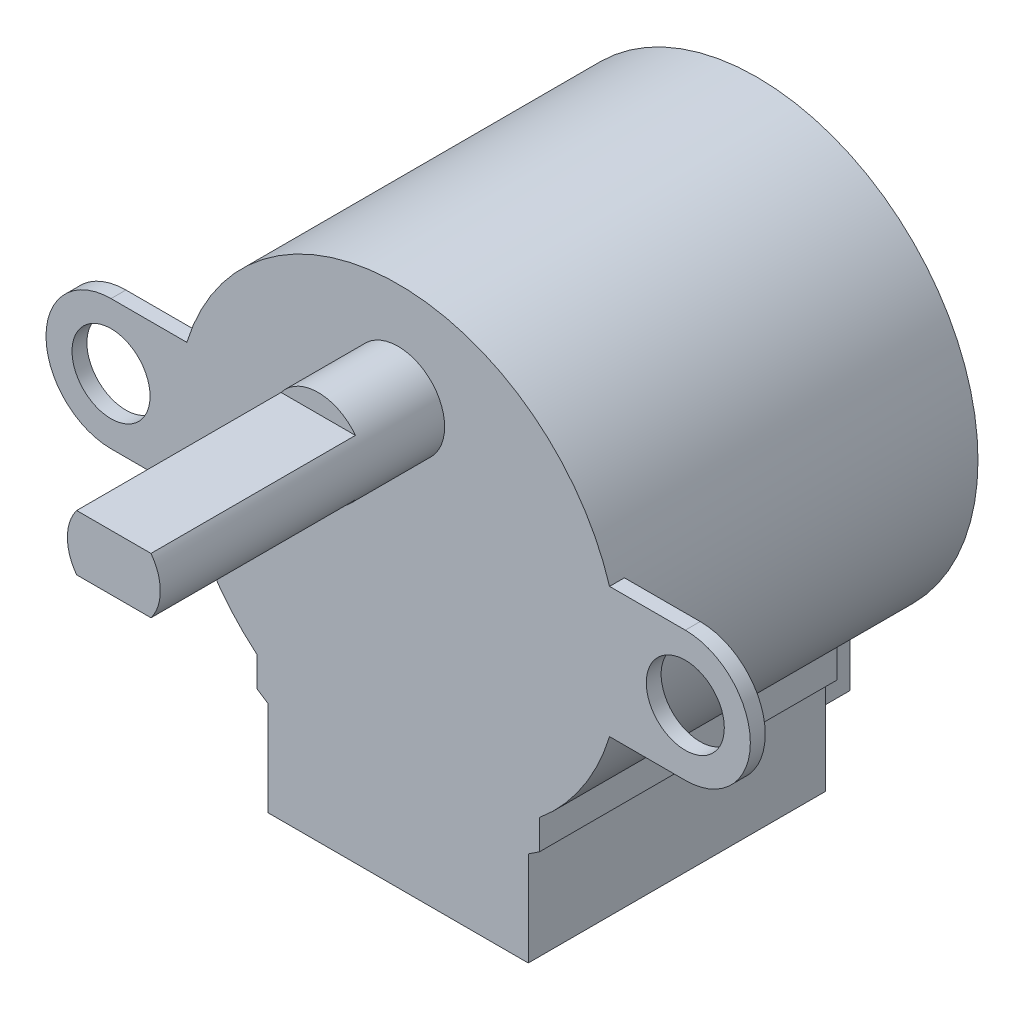
ISO-10303-21;
HEADER;
FILE_DESCRIPTION(('STEP AP214'),'2;1');
FILE_NAME('part.step','',(''),(''),'','','');
FILE_SCHEMA(('AUTOMOTIVE_DESIGN { 1 0 10303 214 1 1 1 1 }'));
ENDSEC;
DATA;
#1=APPLICATION_CONTEXT('core data for automotive mechanical design processes');
#2=APPLICATION_PROTOCOL_DEFINITION('international standard','automotive_design',2000,#1);
#3=PRODUCT_CONTEXT('',#1,'mechanical');
#4=PRODUCT('Part','Part','',(#3));
#5=PRODUCT_RELATED_PRODUCT_CATEGORY('part','',(#4));
#6=PRODUCT_DEFINITION_FORMATION('','',#4);
#7=PRODUCT_DEFINITION_CONTEXT('part definition',#1,'design');
#8=PRODUCT_DEFINITION('design','',#6,#7);
#9=PRODUCT_DEFINITION_SHAPE('','',#8);
#10=(LENGTH_UNIT() NAMED_UNIT(*) SI_UNIT(.MILLI.,.METRE.));
#11=(NAMED_UNIT(*) PLANE_ANGLE_UNIT() SI_UNIT($,.RADIAN.));
#12=(NAMED_UNIT(*) SI_UNIT($,.STERADIAN.) SOLID_ANGLE_UNIT());
#13=UNCERTAINTY_MEASURE_WITH_UNIT(LENGTH_MEASURE(1.E-05),#10,'distance_accuracy_value','');
#14=(GEOMETRIC_REPRESENTATION_CONTEXT(3) GLOBAL_UNCERTAINTY_ASSIGNED_CONTEXT((#13)) GLOBAL_UNIT_ASSIGNED_CONTEXT((#10,
#11,#12)) REPRESENTATION_CONTEXT('',''));
#15=CARTESIAN_POINT('',(0.,0.,0.));
#16=DIRECTION('',(0.,0.,1.));
#17=DIRECTION('',(1.,0.,0.));
#18=AXIS2_PLACEMENT_3D('',#15,#16,#17);
#19=CARTESIAN_POINT('',(0.,0.,0.));
#20=DIRECTION('',(0.,0.,1.));
#21=DIRECTION('',(1.,0.,0.));
#22=AXIS2_PLACEMENT_3D('',#19,#20,#21);
#23=PLANE('',#22);
#24=CARTESIAN_POINT('',(15.45,0.,0.));
#25=DIRECTION('',(0.,0.,1.));
#26=DIRECTION('',(1.,0.,0.));
#27=AXIS2_PLACEMENT_3D('',#24,#25,#26);
#28=CIRCLE('',#27,2.1);
#29=CARTESIAN_POINT('',(17.55,0.,0.));
#30=VERTEX_POINT('',#29);
#31=EDGE_CURVE('E285',#30,#30,#28,.T.);
#32=ORIENTED_EDGE('',*,*,#31,.F.);
#33=EDGE_LOOP('',(#32));
#34=FACE_BOUND('',#33,.T.);
#35=CARTESIAN_POINT('',(-15.45,0.,0.));
#36=DIRECTION('',(0.,0.,1.));
#37=DIRECTION('',(1.,0.,0.));
#38=AXIS2_PLACEMENT_3D('',#35,#36,#37);
#39=CIRCLE('',#38,2.1);
#40=CARTESIAN_POINT('',(-13.35,0.,0.));
#41=VERTEX_POINT('',#40);
#42=EDGE_CURVE('E317',#41,#41,#39,.T.);
#43=ORIENTED_EDGE('',*,*,#42,.F.);
#44=EDGE_LOOP('',(#43));
#45=FACE_BOUND('',#44,.T.);
#46=CARTESIAN_POINT('',(0.,0.,0.));
#47=DIRECTION('',(0.,0.,1.));
#48=DIRECTION('',(1.,0.,0.));
#49=AXIS2_PLACEMENT_3D('',#46,#47,#48);
#50=CIRCLE('',#49,11.9);
#51=CARTESIAN_POINT('',(7.6,-9.15696456256111,0.));
#52=VERTEX_POINT('',#51);
#53=CARTESIAN_POINT('',(11.3736537664903,-3.50000000000001,0.));
#54=VERTEX_POINT('',#53);
#55=EDGE_CURVE('E439',#52,#54,#50,.T.);
#56=ORIENTED_EDGE('',*,*,#55,.T.);
#57=DIRECTION('',(1.,0.,0.));
#58=VECTOR('',#57,1.);
#59=CARTESIAN_POINT('',(15.45,-3.5,0.));
#60=LINE('',#59,#58);
#61=CARTESIAN_POINT('',(15.45,-3.5,0.));
#62=VERTEX_POINT('',#61);
#63=EDGE_CURVE('E299',#54,#62,#60,.T.);
#64=ORIENTED_EDGE('',*,*,#63,.T.);
#65=CARTESIAN_POINT('',(15.45,0.,0.));
#66=DIRECTION('',(0.,0.,1.));
#67=DIRECTION('',(1.,0.,0.));
#68=AXIS2_PLACEMENT_3D('',#65,#66,#67);
#69=CIRCLE('',#68,3.5);
#70=CARTESIAN_POINT('',(15.45,3.5,0.));
#71=VERTEX_POINT('',#70);
#72=EDGE_CURVE('E292',#62,#71,#69,.T.);
#73=ORIENTED_EDGE('',*,*,#72,.T.);
#74=DIRECTION('',(-1.,0.,0.));
#75=VECTOR('',#74,1.);
#76=CARTESIAN_POINT('',(15.45,3.5,0.));
#77=LINE('',#76,#75);
#78=CARTESIAN_POINT('',(11.3736537664903,3.5,0.));
#79=VERTEX_POINT('',#78);
#80=EDGE_CURVE('E311',#71,#79,#77,.T.);
#81=ORIENTED_EDGE('',*,*,#80,.T.);
#82=CARTESIAN_POINT('',(-11.3736537664903,3.5,0.));
#83=VERTEX_POINT('',#82);
#84=EDGE_CURVE('E448',#79,#83,#50,.T.);
#85=ORIENTED_EDGE('',*,*,#84,.T.);
#86=DIRECTION('',(-1.,0.,0.));
#87=VECTOR('',#86,1.);
#88=CARTESIAN_POINT('',(-15.45,3.5,0.));
#89=LINE('',#88,#87);
#90=CARTESIAN_POINT('',(-15.45,3.5,0.));
#91=VERTEX_POINT('',#90);
#92=EDGE_CURVE('E335',#83,#91,#89,.T.);
#93=ORIENTED_EDGE('',*,*,#92,.T.);
#94=CARTESIAN_POINT('',(-15.45,0.,0.));
#95=DIRECTION('',(0.,0.,1.));
#96=DIRECTION('',(1.,0.,0.));
#97=AXIS2_PLACEMENT_3D('',#94,#95,#96);
#98=CIRCLE('',#97,3.5);
#99=CARTESIAN_POINT('',(-15.45,-3.5,0.));
#100=VERTEX_POINT('',#99);
#101=EDGE_CURVE('E328',#91,#100,#98,.T.);
#102=ORIENTED_EDGE('',*,*,#101,.T.);
#103=DIRECTION('',(1.,0.,0.));
#104=VECTOR('',#103,1.);
#105=CARTESIAN_POINT('',(-15.45,-3.5,0.));
#106=LINE('',#105,#104);
#107=CARTESIAN_POINT('',(-11.3736537664903,-3.5,0.));
#108=VERTEX_POINT('',#107);
#109=EDGE_CURVE('E347',#100,#108,#106,.T.);
#110=ORIENTED_EDGE('',*,*,#109,.T.);
#111=CARTESIAN_POINT('',(-7.6,-9.15696456256111,0.));
#112=VERTEX_POINT('',#111);
#113=EDGE_CURVE('E418',#108,#112,#50,.T.);
#114=ORIENTED_EDGE('',*,*,#113,.T.);
#115=DIRECTION('',(0.,-1.,0.));
#116=VECTOR('',#115,1.);
#117=CARTESIAN_POINT('',(-7.6,-10.7569645625611,0.));
#118=LINE('',#117,#116);
#119=CARTESIAN_POINT('',(-7.6,-10.7569645625611,0.));
#120=VERTEX_POINT('',#119);
#121=EDGE_CURVE('E406',#112,#120,#118,.T.);
#122=ORIENTED_EDGE('',*,*,#121,.T.);
#123=DIRECTION('',(0.835522663765061,-0.549455983983191,0.));
#124=VECTOR('',#123,1.);
#125=CARTESIAN_POINT('',(-7.,-11.151536253656,0.));
#126=LINE('',#125,#124);
#127=CARTESIAN_POINT('',(-7.,-11.151536253656,0.));
#128=VERTEX_POINT('',#127);
#129=EDGE_CURVE('E409',#120,#128,#126,.T.);
#130=ORIENTED_EDGE('',*,*,#129,.T.);
#131=DIRECTION('',(0.,-1.,0.));
#132=VECTOR('',#131,1.);
#133=CARTESIAN_POINT('',(-6.99999999999999,-16.2377112189195,0.));
#134=LINE('',#133,#132);
#135=CARTESIAN_POINT('',(-6.99999999999999,-16.2377112189195,0.));
#136=VERTEX_POINT('',#135);
#137=EDGE_CURVE('E412',#128,#136,#134,.T.);
#138=ORIENTED_EDGE('',*,*,#137,.T.);
#139=DIRECTION('',(1.,0.,0.));
#140=VECTOR('',#139,1.);
#141=CARTESIAN_POINT('',(0.,-16.2377112189195,0.));
#142=LINE('',#141,#140);
#143=CARTESIAN_POINT('',(7.,-16.2377112189195,0.));
#144=VERTEX_POINT('',#143);
#145=EDGE_CURVE('E365',#136,#144,#142,.T.);
#146=ORIENTED_EDGE('',*,*,#145,.T.);
#147=DIRECTION('',(0.,1.,0.));
#148=VECTOR('',#147,1.);
#149=CARTESIAN_POINT('',(7.,-16.2377112189195,0.));
#150=LINE('',#149,#148);
#151=CARTESIAN_POINT('',(7.,-11.151536253656,0.));
#152=VERTEX_POINT('',#151);
#153=EDGE_CURVE('E353',#144,#152,#150,.T.);
#154=ORIENTED_EDGE('',*,*,#153,.T.);
#155=DIRECTION('',(0.835522663765057,0.549455983983197,0.));
#156=VECTOR('',#155,1.);
#157=CARTESIAN_POINT('',(7.,-11.151536253656,0.));
#158=LINE('',#157,#156);
#159=CARTESIAN_POINT('',(7.6,-10.7569645625611,0.));
#160=VERTEX_POINT('',#159);
#161=EDGE_CURVE('E401',#152,#160,#158,.T.);
#162=ORIENTED_EDGE('',*,*,#161,.T.);
#163=DIRECTION('',(0.,1.,0.));
#164=VECTOR('',#163,1.);
#165=CARTESIAN_POINT('',(7.6,-10.7569645625611,0.));
#166=LINE('',#165,#164);
#167=EDGE_CURVE('E404',#160,#52,#166,.T.);
#168=ORIENTED_EDGE('',*,*,#167,.T.);
#169=EDGE_LOOP('',(#56,#64,#73,#81,#85,#93,#102,#110,#114,#122,#130,#138,#146,#154,#162,#168));
#170=FACE_BOUND('',#169,.T.);
#171=CARTESIAN_POINT('',(0.,6.5,0.));
#172=DIRECTION('',(0.,0.,1.));
#173=DIRECTION('',(1.,0.,0.));
#174=AXIS2_PLACEMENT_3D('',#171,#172,#173);
#175=CIRCLE('',#174,2.5);
#176=CARTESIAN_POINT('',(2.5,6.5,0.));
#177=VERTEX_POINT('',#176);
#178=EDGE_CURVE('E280',#177,#177,#175,.T.);
#179=ORIENTED_EDGE('',*,*,#178,.F.);
#180=EDGE_LOOP('',(#179));
#181=FACE_BOUND('',#180,.T.);
#182=ADVANCED_FACE('F32',(#34,#45,#170,#181),#23,.T.);
#183=CARTESIAN_POINT('',(-5.,-14.1986110217935,-19.3));
#184=DIRECTION('',(-1.,0.,0.));
#185=DIRECTION('',(0.,0.,1.));
#186=AXIS2_PLACEMENT_3D('',#183,#184,#185);
#187=PLANE('',#186);
#188=DIRECTION('',(0.,0.,1.));
#189=VECTOR('',#188,1.);
#190=CARTESIAN_POINT('',(-5.,-14.1986110217935,-19.3));
#191=LINE('',#190,#189);
#192=CARTESIAN_POINT('',(-5.,-14.1986110217935,-19.3));
#193=VERTEX_POINT('',#192);
#194=CARTESIAN_POINT('',(-5.,-14.1986110217935,-16.));
#195=VERTEX_POINT('',#194);
#196=EDGE_CURVE('E36',#193,#195,#191,.T.);
#197=ORIENTED_EDGE('',*,*,#196,.T.);
#198=DIRECTION('',(0.,1.,0.));
#199=VECTOR('',#198,1.);
#200=CARTESIAN_POINT('',(-5.,-10.7986110217935,-16.));
#201=LINE('',#200,#199);
#202=CARTESIAN_POINT('',(-5.,-10.7986110217935,-16.));
#203=VERTEX_POINT('',#202);
#204=EDGE_CURVE('E383',#195,#203,#201,.T.);
#205=ORIENTED_EDGE('',*,*,#204,.T.);
#206=DIRECTION('',(0.,0.,1.));
#207=VECTOR('',#206,1.);
#208=CARTESIAN_POINT('',(-5.,-10.7986110217935,-19.3));
#209=LINE('',#208,#207);
#210=CARTESIAN_POINT('',(-5.,-10.7986110217935,-19.3));
#211=VERTEX_POINT('',#210);
#212=EDGE_CURVE('E11',#211,#203,#209,.T.);
#213=ORIENTED_EDGE('',*,*,#212,.F.);
#214=DIRECTION('',(0.,-1.,0.));
#215=VECTOR('',#214,1.);
#216=CARTESIAN_POINT('',(-5.,-14.1986110217935,-19.3));
#217=LINE('',#216,#215);
#218=EDGE_CURVE('E435',#211,#193,#217,.T.);
#219=ORIENTED_EDGE('',*,*,#218,.T.);
#220=EDGE_LOOP('',(#197,#205,#213,#219));
#221=FACE_BOUND('',#220,.T.);
#222=ADVANCED_FACE('F34',(#221),#187,.T.);
#223=CARTESIAN_POINT('',(5.,-14.1986110217935,-19.3));
#224=DIRECTION('',(1.,0.,0.));
#225=DIRECTION('',(0.,0.,-1.));
#226=AXIS2_PLACEMENT_3D('',#223,#224,#225);
#227=PLANE('',#226);
#228=DIRECTION('',(0.,0.,1.));
#229=VECTOR('',#228,1.);
#230=CARTESIAN_POINT('',(5.,-10.7986110217935,-19.3));
#231=LINE('',#230,#229);
#232=CARTESIAN_POINT('',(5.,-10.7986110217935,-19.3));
#233=VERTEX_POINT('',#232);
#234=CARTESIAN_POINT('',(5.,-10.7986110217935,-16.));
#235=VERTEX_POINT('',#234);
#236=EDGE_CURVE('E41',#233,#235,#231,.T.);
#237=ORIENTED_EDGE('',*,*,#236,.T.);
#238=DIRECTION('',(0.,-1.,0.));
#239=VECTOR('',#238,1.);
#240=CARTESIAN_POINT('',(5.,-14.1986110217935,-16.));
#241=LINE('',#240,#239);
#242=CARTESIAN_POINT('',(5.,-14.1986110217935,-16.));
#243=VERTEX_POINT('',#242);
#244=EDGE_CURVE('E377',#235,#243,#241,.T.);
#245=ORIENTED_EDGE('',*,*,#244,.T.);
#246=DIRECTION('',(0.,0.,1.));
#247=VECTOR('',#246,1.);
#248=CARTESIAN_POINT('',(5.,-14.1986110217935,-19.3));
#249=LINE('',#248,#247);
#250=CARTESIAN_POINT('',(5.,-14.1986110217935,-19.3));
#251=VERTEX_POINT('',#250);
#252=EDGE_CURVE('E451',#251,#243,#249,.T.);
#253=ORIENTED_EDGE('',*,*,#252,.F.);
#254=DIRECTION('',(0.,1.,0.));
#255=VECTOR('',#254,1.);
#256=CARTESIAN_POINT('',(5.,-14.1986110217935,-19.3));
#257=LINE('',#256,#255);
#258=EDGE_CURVE('E441',#251,#233,#257,.T.);
#259=ORIENTED_EDGE('',*,*,#258,.T.);
#260=EDGE_LOOP('',(#237,#245,#253,#259));
#261=FACE_BOUND('',#260,.T.);
#262=ADVANCED_FACE('F465',(#261),#227,.T.);
#263=CARTESIAN_POINT('',(5.,-14.1986110217935,-19.3));
#264=DIRECTION('',(0.,-1.,0.));
#265=DIRECTION('',(0.,0.,-1.));
#266=AXIS2_PLACEMENT_3D('',#263,#264,#265);
#267=PLANE('',#266);
#268=ORIENTED_EDGE('',*,*,#252,.T.);
#269=DIRECTION('',(-1.,0.,0.));
#270=VECTOR('',#269,1.);
#271=CARTESIAN_POINT('',(-5.,-14.1986110217935,-16.));
#272=LINE('',#271,#270);
#273=EDGE_CURVE('E380',#243,#195,#272,.T.);
#274=ORIENTED_EDGE('',*,*,#273,.T.);
#275=ORIENTED_EDGE('',*,*,#196,.F.);
#276=DIRECTION('',(1.,0.,0.));
#277=VECTOR('',#276,1.);
#278=CARTESIAN_POINT('',(-5.,-14.1986110217935,-19.3));
#279=LINE('',#278,#277);
#280=EDGE_CURVE('E438',#193,#251,#279,.T.);
#281=ORIENTED_EDGE('',*,*,#280,.T.);
#282=EDGE_LOOP('',(#268,#274,#275,#281));
#283=FACE_BOUND('',#282,.T.);
#284=ADVANCED_FACE('F459',(#283),#267,.T.);
#285=CARTESIAN_POINT('',(0.,0.,-19.3));
#286=DIRECTION('',(0.,0.,1.));
#287=DIRECTION('',(1.,0.,0.));
#288=AXIS2_PLACEMENT_3D('',#285,#286,#287);
#289=CYLINDRICAL_SURFACE('',#288,11.9);
#290=DIRECTION('',(0.,0.,1.));
#291=VECTOR('',#290,1.);
#292=CARTESIAN_POINT('',(11.3736537664903,-3.50000000000001,-0.8));
#293=LINE('',#292,#291);
#294=CARTESIAN_POINT('',(11.3736537664903,-3.50000000000001,-0.8));
#295=VERTEX_POINT('',#294);
#296=EDGE_CURVE('E318',#295,#54,#293,.T.);
#297=ORIENTED_EDGE('',*,*,#296,.T.);
#298=ORIENTED_EDGE('',*,*,#55,.F.);
#299=DIRECTION('',(0.,0.,1.));
#300=VECTOR('',#299,1.);
#301=CARTESIAN_POINT('',(7.6,-9.15696456256112,-16.));
#302=LINE('',#301,#300);
#303=CARTESIAN_POINT('',(7.6,-9.15696456256112,-16.));
#304=VERTEX_POINT('',#303);
#305=EDGE_CURVE('E426',#304,#52,#302,.T.);
#306=ORIENTED_EDGE('',*,*,#305,.F.);
#307=CARTESIAN_POINT('',(0.,0.,-16.));
#308=DIRECTION('',(0.,0.,-1.));
#309=DIRECTION('',(1.,0.,0.));
#310=AXIS2_PLACEMENT_3D('',#307,#308,#309);
#311=CIRCLE('',#310,11.9);
#312=EDGE_CURVE('E374',#304,#235,#311,.T.);
#313=ORIENTED_EDGE('',*,*,#312,.T.);
#314=ORIENTED_EDGE('',*,*,#236,.F.);
#315=CARTESIAN_POINT('',(0.,0.,-19.3));
#316=DIRECTION('',(0.,0.,1.));
#317=DIRECTION('',(1.,0.,0.));
#318=AXIS2_PLACEMENT_3D('',#315,#316,#317);
#319=CIRCLE('',#318,11.9);
#320=EDGE_CURVE('E444',#233,#211,#319,.T.);
#321=ORIENTED_EDGE('',*,*,#320,.T.);
#322=ORIENTED_EDGE('',*,*,#212,.T.);
#323=CARTESIAN_POINT('',(0.,0.,-16.));
#324=DIRECTION('',(0.,0.,-1.));
#325=DIRECTION('',(1.,0.,0.));
#326=AXIS2_PLACEMENT_3D('',#323,#324,#325);
#327=CIRCLE('',#326,11.9);
#328=CARTESIAN_POINT('',(-7.6,-9.15696456256111,-16.));
#329=VERTEX_POINT('',#328);
#330=EDGE_CURVE('E386',#203,#329,#327,.T.);
#331=ORIENTED_EDGE('',*,*,#330,.T.);
#332=DIRECTION('',(0.,0.,1.));
#333=VECTOR('',#332,1.);
#334=CARTESIAN_POINT('',(-7.6,-9.15696456256111,-16.));
#335=LINE('',#334,#333);
#336=EDGE_CURVE('E423',#329,#112,#335,.T.);
#337=ORIENTED_EDGE('',*,*,#336,.T.);
#338=ORIENTED_EDGE('',*,*,#113,.F.);
#339=DIRECTION('',(0.,0.,1.));
#340=VECTOR('',#339,1.);
#341=CARTESIAN_POINT('',(-11.3736537664903,-3.5,-0.8));
#342=LINE('',#341,#340);
#343=CARTESIAN_POINT('',(-11.3736537664903,-3.5,-0.8));
#344=VERTEX_POINT('',#343);
#345=EDGE_CURVE('E357',#344,#108,#342,.T.);
#346=ORIENTED_EDGE('',*,*,#345,.F.);
#347=CARTESIAN_POINT('',(0.,0.,-0.8));
#348=DIRECTION('',(0.,0.,-1.));
#349=DIRECTION('',(1.,0.,0.));
#350=AXIS2_PLACEMENT_3D('',#347,#348,#349);
#351=CIRCLE('',#350,11.9);
#352=CARTESIAN_POINT('',(-11.3736537664903,3.5,-0.8));
#353=VERTEX_POINT('',#352);
#354=EDGE_CURVE('E338',#344,#353,#351,.T.);
#355=ORIENTED_EDGE('',*,*,#354,.T.);
#356=DIRECTION('',(0.,0.,1.));
#357=VECTOR('',#356,1.);
#358=CARTESIAN_POINT('',(-11.3736537664903,3.5,-0.8));
#359=LINE('',#358,#357);
#360=EDGE_CURVE('E354',#353,#83,#359,.T.);
#361=ORIENTED_EDGE('',*,*,#360,.T.);
#362=ORIENTED_EDGE('',*,*,#84,.F.);
#363=DIRECTION('',(0.,0.,1.));
#364=VECTOR('',#363,1.);
#365=CARTESIAN_POINT('',(11.3736537664903,3.5,-0.8));
#366=LINE('',#365,#364);
#367=CARTESIAN_POINT('',(11.3736537664903,3.5,-0.8));
#368=VERTEX_POINT('',#367);
#369=EDGE_CURVE('E321',#368,#79,#366,.T.);
#370=ORIENTED_EDGE('',*,*,#369,.F.);
#371=CARTESIAN_POINT('',(0.,0.,-0.8));
#372=DIRECTION('',(0.,0.,-1.));
#373=DIRECTION('',(1.,0.,0.));
#374=AXIS2_PLACEMENT_3D('',#371,#372,#373);
#375=CIRCLE('',#374,11.9);
#376=EDGE_CURVE('E302',#368,#295,#375,.T.);
#377=ORIENTED_EDGE('',*,*,#376,.T.);
#378=EDGE_LOOP('',(#297,#298,#306,#313,#314,#321,#322,#331,#337,#338,#346,#355,#361,#362,#370,#377));
#379=FACE_BOUND('',#378,.T.);
#380=ADVANCED_FACE('F471',(#379),#289,.T.);
#381=CARTESIAN_POINT('',(0.,0.,-19.3));
#382=DIRECTION('',(0.,0.,1.));
#383=DIRECTION('',(1.,0.,0.));
#384=AXIS2_PLACEMENT_3D('',#381,#382,#383);
#385=PLANE('',#384);
#386=ORIENTED_EDGE('',*,*,#218,.F.);
#387=ORIENTED_EDGE('',*,*,#320,.F.);
#388=ORIENTED_EDGE('',*,*,#258,.F.);
#389=ORIENTED_EDGE('',*,*,#280,.F.);
#390=EDGE_LOOP('',(#386,#387,#388,#389));
#391=FACE_BOUND('',#390,.T.);
#392=ADVANCED_FACE('F462',(#391),#385,.F.);
#393=CARTESIAN_POINT('',(0.,-16.2377112189195,-16.));
#394=DIRECTION('',(0.,-1.,0.));
#395=DIRECTION('',(0.,0.,-1.));
#396=AXIS2_PLACEMENT_3D('',#393,#394,#395);
#397=PLANE('',#396);
#398=DIRECTION('',(-1.,0.,0.));
#399=VECTOR('',#398,1.);
#400=CARTESIAN_POINT('',(0.,-16.2377112189195,-2.));
#401=LINE('',#400,#399);
#402=CARTESIAN_POINT('',(3.25,-16.2377112189195,-2.));
#403=VERTEX_POINT('',#402);
#404=CARTESIAN_POINT('',(-3.25,-16.2377112189195,-2.));
#405=VERTEX_POINT('',#404);
#406=EDGE_CURVE('E224',#403,#405,#401,.T.);
#407=ORIENTED_EDGE('',*,*,#406,.F.);
#408=DIRECTION('',(0.,0.,1.));
#409=VECTOR('',#408,1.);
#410=CARTESIAN_POINT('',(3.25,-16.2377112189195,-2.));
#411=LINE('',#410,#409);
#412=CARTESIAN_POINT('',(3.25,-16.2377112189195,-3.2));
#413=VERTEX_POINT('',#412);
#414=EDGE_CURVE('E240',#413,#403,#411,.T.);
#415=ORIENTED_EDGE('',*,*,#414,.F.);
#416=DIRECTION('',(1.,0.,0.));
#417=VECTOR('',#416,1.);
#418=CARTESIAN_POINT('',(0.,-16.2377112189195,-3.2));
#419=LINE('',#418,#417);
#420=CARTESIAN_POINT('',(-3.25,-16.2377112189195,-3.2));
#421=VERTEX_POINT('',#420);
#422=EDGE_CURVE('E247',#421,#413,#419,.T.);
#423=ORIENTED_EDGE('',*,*,#422,.F.);
#424=DIRECTION('',(0.,0.,-1.));
#425=VECTOR('',#424,1.);
#426=CARTESIAN_POINT('',(-3.25,-16.2377112189195,-2.));
#427=LINE('',#426,#425);
#428=EDGE_CURVE('E245',#405,#421,#427,.T.);
#429=ORIENTED_EDGE('',*,*,#428,.F.);
#430=EDGE_LOOP('',(#407,#415,#423,#429));
#431=FACE_BOUND('',#430,.T.);
#432=ORIENTED_EDGE('',*,*,#145,.F.);
#433=DIRECTION('',(0.,0.,1.));
#434=VECTOR('',#433,1.);
#435=CARTESIAN_POINT('',(-6.99999999999999,-16.2377112189195,-16.));
#436=LINE('',#435,#434);
#437=CARTESIAN_POINT('',(-6.99999999999999,-16.2377112189195,-16.));
#438=VERTEX_POINT('',#437);
#439=EDGE_CURVE('E416',#438,#136,#436,.T.);
#440=ORIENTED_EDGE('',*,*,#439,.F.);
#441=DIRECTION('',(1.,0.,0.));
#442=VECTOR('',#441,1.);
#443=CARTESIAN_POINT('',(0.,-16.2377112189195,-16.));
#444=LINE('',#443,#442);
#445=CARTESIAN_POINT('',(7.,-16.2377112189195,-16.));
#446=VERTEX_POINT('',#445);
#447=EDGE_CURVE('E361',#438,#446,#444,.T.);
#448=ORIENTED_EDGE('',*,*,#447,.T.);
#449=DIRECTION('',(0.,0.,1.));
#450=VECTOR('',#449,1.);
#451=CARTESIAN_POINT('',(7.,-16.2377112189195,-16.));
#452=LINE('',#451,#450);
#453=EDGE_CURVE('E398',#446,#144,#452,.T.);
#454=ORIENTED_EDGE('',*,*,#453,.T.);
#455=EDGE_LOOP('',(#432,#440,#448,#454));
#456=FACE_BOUND('',#455,.T.);
#457=ADVANCED_FACE('F488',(#431,#456),#397,.T.);
#458=CARTESIAN_POINT('',(-6.99999999999999,-16.2377112189195,-16.));
#459=DIRECTION('',(-1.,0.,0.));
#460=DIRECTION('',(0.,-1.,0.));
#461=AXIS2_PLACEMENT_3D('',#458,#459,#460);
#462=PLANE('',#461);
#463=ORIENTED_EDGE('',*,*,#137,.F.);
#464=DIRECTION('',(0.,0.,1.));
#465=VECTOR('',#464,1.);
#466=CARTESIAN_POINT('',(-7.,-11.151536253656,-16.));
#467=LINE('',#466,#465);
#468=CARTESIAN_POINT('',(-7.,-11.151536253656,-16.));
#469=VERTEX_POINT('',#468);
#470=EDGE_CURVE('E419',#469,#128,#467,.T.);
#471=ORIENTED_EDGE('',*,*,#470,.F.);
#472=DIRECTION('',(0.,-1.,0.));
#473=VECTOR('',#472,1.);
#474=CARTESIAN_POINT('',(-6.99999999999999,-16.2377112189195,-16.));
#475=LINE('',#474,#473);
#476=EDGE_CURVE('E395',#469,#438,#475,.T.);
#477=ORIENTED_EDGE('',*,*,#476,.T.);
#478=ORIENTED_EDGE('',*,*,#439,.T.);
#479=EDGE_LOOP('',(#463,#471,#477,#478));
#480=FACE_BOUND('',#479,.T.);
#481=ADVANCED_FACE('F491',(#480),#462,.T.);
#482=CARTESIAN_POINT('',(-7.,-11.151536253656,-16.));
#483=DIRECTION('',(-0.549455983983191,-0.835522663765061,0.));
#484=DIRECTION('',(0.835522663765061,-0.549455983983191,0.));
#485=AXIS2_PLACEMENT_3D('',#482,#483,#484);
#486=PLANE('',#485);
#487=ORIENTED_EDGE('',*,*,#129,.F.);
#488=DIRECTION('',(0.,0.,1.));
#489=VECTOR('',#488,1.);
#490=CARTESIAN_POINT('',(-7.6,-10.7569645625611,-16.));
#491=LINE('',#490,#489);
#492=CARTESIAN_POINT('',(-7.6,-10.7569645625611,-16.));
#493=VERTEX_POINT('',#492);
#494=EDGE_CURVE('E421',#493,#120,#491,.T.);
#495=ORIENTED_EDGE('',*,*,#494,.F.);
#496=DIRECTION('',(0.835522663765061,-0.549455983983191,0.));
#497=VECTOR('',#496,1.);
#498=CARTESIAN_POINT('',(-7.,-11.151536253656,-16.));
#499=LINE('',#498,#497);
#500=EDGE_CURVE('E392',#493,#469,#499,.T.);
#501=ORIENTED_EDGE('',*,*,#500,.T.);
#502=ORIENTED_EDGE('',*,*,#470,.T.);
#503=EDGE_LOOP('',(#487,#495,#501,#502));
#504=FACE_BOUND('',#503,.T.);
#505=ADVANCED_FACE('F496',(#504),#486,.T.);
#506=CARTESIAN_POINT('',(-7.6,-10.7569645625611,-16.));
#507=DIRECTION('',(-1.,0.,0.));
#508=DIRECTION('',(0.,0.,1.));
#509=AXIS2_PLACEMENT_3D('',#506,#507,#508);
#510=PLANE('',#509);
#511=ORIENTED_EDGE('',*,*,#121,.F.);
#512=ORIENTED_EDGE('',*,*,#336,.F.);
#513=DIRECTION('',(0.,-1.,0.));
#514=VECTOR('',#513,1.);
#515=CARTESIAN_POINT('',(-7.6,-10.7569645625611,-16.));
#516=LINE('',#515,#514);
#517=EDGE_CURVE('E389',#329,#493,#516,.T.);
#518=ORIENTED_EDGE('',*,*,#517,.T.);
#519=ORIENTED_EDGE('',*,*,#494,.T.);
#520=EDGE_LOOP('',(#511,#512,#518,#519));
#521=FACE_BOUND('',#520,.T.);
#522=ADVANCED_FACE('F499',(#521),#510,.T.);
#523=CARTESIAN_POINT('',(7.6,-10.7569645625611,-16.));
#524=DIRECTION('',(1.,0.,0.));
#525=DIRECTION('',(0.,0.,-1.));
#526=AXIS2_PLACEMENT_3D('',#523,#524,#525);
#527=PLANE('',#526);
#528=ORIENTED_EDGE('',*,*,#167,.F.);
#529=DIRECTION('',(0.,0.,1.));
#530=VECTOR('',#529,1.);
#531=CARTESIAN_POINT('',(7.6,-10.7569645625611,-16.));
#532=LINE('',#531,#530);
#533=CARTESIAN_POINT('',(7.6,-10.7569645625611,-16.));
#534=VERTEX_POINT('',#533);
#535=EDGE_CURVE('E429',#534,#160,#532,.T.);
#536=ORIENTED_EDGE('',*,*,#535,.F.);
#537=DIRECTION('',(0.,1.,0.));
#538=VECTOR('',#537,1.);
#539=CARTESIAN_POINT('',(7.6,-10.7569645625611,-16.));
#540=LINE('',#539,#538);
#541=EDGE_CURVE('E371',#534,#304,#540,.T.);
#542=ORIENTED_EDGE('',*,*,#541,.T.);
#543=ORIENTED_EDGE('',*,*,#305,.T.);
#544=EDGE_LOOP('',(#528,#536,#542,#543));
#545=FACE_BOUND('',#544,.T.);
#546=ADVANCED_FACE('F475',(#545),#527,.T.);
#547=CARTESIAN_POINT('',(7.,-11.151536253656,-16.));
#548=DIRECTION('',(0.549455983983197,-0.835522663765057,0.));
#549=DIRECTION('',(0.835522663765057,0.549455983983197,0.));
#550=AXIS2_PLACEMENT_3D('',#547,#548,#549);
#551=PLANE('',#550);
#552=ORIENTED_EDGE('',*,*,#161,.F.);
#553=DIRECTION('',(0.,0.,1.));
#554=VECTOR('',#553,1.);
#555=CARTESIAN_POINT('',(7.,-11.151536253656,-16.));
#556=LINE('',#555,#554);
#557=CARTESIAN_POINT('',(7.,-11.151536253656,-16.));
#558=VERTEX_POINT('',#557);
#559=EDGE_CURVE('E431',#558,#152,#556,.T.);
#560=ORIENTED_EDGE('',*,*,#559,.F.);
#561=DIRECTION('',(0.835522663765057,0.549455983983197,0.));
#562=VECTOR('',#561,1.);
#563=CARTESIAN_POINT('',(7.,-11.151536253656,-16.));
#564=LINE('',#563,#562);
#565=EDGE_CURVE('E368',#558,#534,#564,.T.);
#566=ORIENTED_EDGE('',*,*,#565,.T.);
#567=ORIENTED_EDGE('',*,*,#535,.T.);
#568=EDGE_LOOP('',(#552,#560,#566,#567));
#569=FACE_BOUND('',#568,.T.);
#570=ADVANCED_FACE('F480',(#569),#551,.T.);
#571=CARTESIAN_POINT('',(7.,-16.2377112189195,-16.));
#572=DIRECTION('',(1.,0.,0.));
#573=DIRECTION('',(0.,1.,0.));
#574=AXIS2_PLACEMENT_3D('',#571,#572,#573);
#575=PLANE('',#574);
#576=ORIENTED_EDGE('',*,*,#153,.F.);
#577=ORIENTED_EDGE('',*,*,#453,.F.);
#578=DIRECTION('',(0.,1.,0.));
#579=VECTOR('',#578,1.);
#580=CARTESIAN_POINT('',(7.,-16.2377112189195,-16.));
#581=LINE('',#580,#579);
#582=EDGE_CURVE('E364',#446,#558,#581,.T.);
#583=ORIENTED_EDGE('',*,*,#582,.T.);
#584=ORIENTED_EDGE('',*,*,#559,.T.);
#585=EDGE_LOOP('',(#576,#577,#583,#584));
#586=FACE_BOUND('',#585,.T.);
#587=ADVANCED_FACE('F483',(#586),#575,.T.);
#588=CARTESIAN_POINT('',(0.,0.,-16.));
#589=DIRECTION('',(0.,0.,1.));
#590=DIRECTION('',(1.,0.,0.));
#591=AXIS2_PLACEMENT_3D('',#588,#589,#590);
#592=PLANE('',#591);
#593=ORIENTED_EDGE('',*,*,#447,.F.);
#594=ORIENTED_EDGE('',*,*,#476,.F.);
#595=ORIENTED_EDGE('',*,*,#500,.F.);
#596=ORIENTED_EDGE('',*,*,#517,.F.);
#597=ORIENTED_EDGE('',*,*,#330,.F.);
#598=ORIENTED_EDGE('',*,*,#204,.F.);
#599=ORIENTED_EDGE('',*,*,#273,.F.);
#600=ORIENTED_EDGE('',*,*,#244,.F.);
#601=ORIENTED_EDGE('',*,*,#312,.F.);
#602=ORIENTED_EDGE('',*,*,#541,.F.);
#603=ORIENTED_EDGE('',*,*,#565,.F.);
#604=ORIENTED_EDGE('',*,*,#582,.F.);
#605=EDGE_LOOP('',(#593,#594,#595,#596,#597,#598,#599,#600,#601,#602,#603,#604));
#606=FACE_BOUND('',#605,.T.);
#607=ADVANCED_FACE('F467',(#606),#592,.F.);
#608=CARTESIAN_POINT('',(-15.45,0.,-0.8));
#609=DIRECTION('',(0.,0.,1.));
#610=DIRECTION('',(1.,0.,0.));
#611=AXIS2_PLACEMENT_3D('',#608,#609,#610);
#612=CYLINDRICAL_SURFACE('',#611,3.5);
#613=ORIENTED_EDGE('',*,*,#101,.F.);
#614=DIRECTION('',(0.,0.,1.));
#615=VECTOR('',#614,1.);
#616=CARTESIAN_POINT('',(-15.45,3.5,-0.8));
#617=LINE('',#616,#615);
#618=CARTESIAN_POINT('',(-15.45,3.5,-0.8));
#619=VERTEX_POINT('',#618);
#620=EDGE_CURVE('E351',#619,#91,#617,.T.);
#621=ORIENTED_EDGE('',*,*,#620,.F.);
#622=CARTESIAN_POINT('',(-15.45,0.,-0.8));
#623=DIRECTION('',(0.,0.,1.));
#624=DIRECTION('',(1.,0.,0.));
#625=AXIS2_PLACEMENT_3D('',#622,#623,#624);
#626=CIRCLE('',#625,3.5);
#627=CARTESIAN_POINT('',(-15.45,-3.5,-0.8));
#628=VERTEX_POINT('',#627);
#629=EDGE_CURVE('E331',#619,#628,#626,.T.);
#630=ORIENTED_EDGE('',*,*,#629,.T.);
#631=DIRECTION('',(0.,0.,1.));
#632=VECTOR('',#631,1.);
#633=CARTESIAN_POINT('',(-15.45,-3.5,-0.8));
#634=LINE('',#633,#632);
#635=EDGE_CURVE('E344',#628,#100,#634,.T.);
#636=ORIENTED_EDGE('',*,*,#635,.T.);
#637=EDGE_LOOP('',(#613,#621,#630,#636));
#638=FACE_BOUND('',#637,.T.);
#639=ADVANCED_FACE('F520',(#638),#612,.T.);
#640=CARTESIAN_POINT('',(-15.45,3.5,-0.8));
#641=DIRECTION('',(0.,1.,0.));
#642=DIRECTION('',(-1.,0.,0.));
#643=AXIS2_PLACEMENT_3D('',#640,#641,#642);
#644=PLANE('',#643);
#645=ORIENTED_EDGE('',*,*,#92,.F.);
#646=ORIENTED_EDGE('',*,*,#360,.F.);
#647=DIRECTION('',(-1.,0.,0.));
#648=VECTOR('',#647,1.);
#649=CARTESIAN_POINT('',(-15.45,3.5,-0.8));
#650=LINE('',#649,#648);
#651=EDGE_CURVE('E341',#353,#619,#650,.T.);
#652=ORIENTED_EDGE('',*,*,#651,.T.);
#653=ORIENTED_EDGE('',*,*,#620,.T.);
#654=EDGE_LOOP('',(#645,#646,#652,#653));
#655=FACE_BOUND('',#654,.T.);
#656=ADVANCED_FACE('F509',(#655),#644,.T.);
#657=CARTESIAN_POINT('',(-15.45,-3.5,-0.8));
#658=DIRECTION('',(0.,-1.,0.));
#659=DIRECTION('',(1.,0.,0.));
#660=AXIS2_PLACEMENT_3D('',#657,#658,#659);
#661=PLANE('',#660);
#662=ORIENTED_EDGE('',*,*,#109,.F.);
#663=ORIENTED_EDGE('',*,*,#635,.F.);
#664=DIRECTION('',(1.,0.,0.));
#665=VECTOR('',#664,1.);
#666=CARTESIAN_POINT('',(-15.45,-3.5,-0.8));
#667=LINE('',#666,#665);
#668=EDGE_CURVE('E334',#628,#344,#667,.T.);
#669=ORIENTED_EDGE('',*,*,#668,.T.);
#670=ORIENTED_EDGE('',*,*,#345,.T.);
#671=EDGE_LOOP('',(#662,#663,#669,#670));
#672=FACE_BOUND('',#671,.T.);
#673=ADVANCED_FACE('F518',(#672),#661,.T.);
#674=CARTESIAN_POINT('',(-15.45,0.,-0.8));
#675=DIRECTION('',(0.,0.,1.));
#676=DIRECTION('',(1.,0.,0.));
#677=AXIS2_PLACEMENT_3D('',#674,#675,#676);
#678=PLANE('',#677);
#679=CARTESIAN_POINT('',(-15.45,0.,-0.8));
#680=DIRECTION('',(0.,0.,1.));
#681=DIRECTION('',(1.,0.,0.));
#682=AXIS2_PLACEMENT_3D('',#679,#680,#681);
#683=CIRCLE('',#682,2.1);
#684=CARTESIAN_POINT('',(-13.35,0.,-0.8));
#685=VERTEX_POINT('',#684);
#686=EDGE_CURVE('E325',#685,#685,#683,.T.);
#687=ORIENTED_EDGE('',*,*,#686,.T.);
#688=EDGE_LOOP('',(#687));
#689=FACE_BOUND('',#688,.T.);
#690=ORIENTED_EDGE('',*,*,#629,.F.);
#691=ORIENTED_EDGE('',*,*,#651,.F.);
#692=ORIENTED_EDGE('',*,*,#354,.F.);
#693=ORIENTED_EDGE('',*,*,#668,.F.);
#694=EDGE_LOOP('',(#690,#691,#692,#693));
#695=FACE_BOUND('',#694,.T.);
#696=ADVANCED_FACE('F515',(#689,#695),#678,.F.);
#697=CARTESIAN_POINT('',(-15.45,0.,-0.8));
#698=DIRECTION('',(0.,0.,1.));
#699=DIRECTION('',(1.,0.,0.));
#700=AXIS2_PLACEMENT_3D('',#697,#698,#699);
#701=CYLINDRICAL_SURFACE('',#700,2.1);
#702=ORIENTED_EDGE('',*,*,#686,.F.);
#703=EDGE_LOOP('',(#702));
#704=FACE_BOUND('',#703,.T.);
#705=ORIENTED_EDGE('',*,*,#42,.T.);
#706=EDGE_LOOP('',(#705));
#707=FACE_BOUND('',#706,.T.);
#708=ADVANCED_FACE('F634',(#704,#707),#701,.F.);
#709=CARTESIAN_POINT('',(15.45,0.,-0.8));
#710=DIRECTION('',(0.,0.,1.));
#711=DIRECTION('',(1.,0.,0.));
#712=AXIS2_PLACEMENT_3D('',#709,#710,#711);
#713=CYLINDRICAL_SURFACE('',#712,3.5);
#714=ORIENTED_EDGE('',*,*,#72,.F.);
#715=DIRECTION('',(0.,0.,1.));
#716=VECTOR('',#715,1.);
#717=CARTESIAN_POINT('',(15.45,-3.5,-0.8));
#718=LINE('',#717,#716);
#719=CARTESIAN_POINT('',(15.45,-3.5,-0.8));
#720=VERTEX_POINT('',#719);
#721=EDGE_CURVE('E315',#720,#62,#718,.T.);
#722=ORIENTED_EDGE('',*,*,#721,.F.);
#723=CARTESIAN_POINT('',(15.45,0.,-0.8));
#724=DIRECTION('',(0.,0.,1.));
#725=DIRECTION('',(1.,0.,0.));
#726=AXIS2_PLACEMENT_3D('',#723,#724,#725);
#727=CIRCLE('',#726,3.5);
#728=CARTESIAN_POINT('',(15.45,3.5,-0.8));
#729=VERTEX_POINT('',#728);
#730=EDGE_CURVE('E295',#720,#729,#727,.T.);
#731=ORIENTED_EDGE('',*,*,#730,.T.);
#732=DIRECTION('',(0.,0.,1.));
#733=VECTOR('',#732,1.);
#734=CARTESIAN_POINT('',(15.45,3.5,-0.8));
#735=LINE('',#734,#733);
#736=EDGE_CURVE('E308',#729,#71,#735,.T.);
#737=ORIENTED_EDGE('',*,*,#736,.T.);
#738=EDGE_LOOP('',(#714,#722,#731,#737));
#739=FACE_BOUND('',#738,.T.);
#740=ADVANCED_FACE('F643',(#739),#713,.T.);
#741=CARTESIAN_POINT('',(15.45,-3.5,-0.8));
#742=DIRECTION('',(0.,-1.,0.));
#743=DIRECTION('',(1.,0.,0.));
#744=AXIS2_PLACEMENT_3D('',#741,#742,#743);
#745=PLANE('',#744);
#746=ORIENTED_EDGE('',*,*,#63,.F.);
#747=ORIENTED_EDGE('',*,*,#296,.F.);
#748=DIRECTION('',(1.,0.,0.));
#749=VECTOR('',#748,1.);
#750=CARTESIAN_POINT('',(15.45,-3.5,-0.8));
#751=LINE('',#750,#749);
#752=EDGE_CURVE('E305',#295,#720,#751,.T.);
#753=ORIENTED_EDGE('',*,*,#752,.T.);
#754=ORIENTED_EDGE('',*,*,#721,.T.);
#755=EDGE_LOOP('',(#746,#747,#753,#754));
#756=FACE_BOUND('',#755,.T.);
#757=ADVANCED_FACE('F652',(#756),#745,.T.);
#758=CARTESIAN_POINT('',(15.45,3.5,-0.8));
#759=DIRECTION('',(0.,1.,0.));
#760=DIRECTION('',(-1.,0.,0.));
#761=AXIS2_PLACEMENT_3D('',#758,#759,#760);
#762=PLANE('',#761);
#763=ORIENTED_EDGE('',*,*,#80,.F.);
#764=ORIENTED_EDGE('',*,*,#736,.F.);
#765=DIRECTION('',(-1.,0.,0.));
#766=VECTOR('',#765,1.);
#767=CARTESIAN_POINT('',(15.45,3.5,-0.8));
#768=LINE('',#767,#766);
#769=EDGE_CURVE('E298',#729,#368,#768,.T.);
#770=ORIENTED_EDGE('',*,*,#769,.T.);
#771=ORIENTED_EDGE('',*,*,#369,.T.);
#772=EDGE_LOOP('',(#763,#764,#770,#771));
#773=FACE_BOUND('',#772,.T.);
#774=ADVANCED_FACE('F661',(#773),#762,.T.);
#775=CARTESIAN_POINT('',(15.45,0.,-0.8));
#776=DIRECTION('',(0.,0.,1.));
#777=DIRECTION('',(1.,0.,0.));
#778=AXIS2_PLACEMENT_3D('',#775,#776,#777);
#779=PLANE('',#778);
#780=CARTESIAN_POINT('',(15.45,0.,-0.8));
#781=DIRECTION('',(0.,0.,1.));
#782=DIRECTION('',(1.,0.,0.));
#783=AXIS2_PLACEMENT_3D('',#780,#781,#782);
#784=CIRCLE('',#783,2.1);
#785=CARTESIAN_POINT('',(17.55,0.,-0.8));
#786=VERTEX_POINT('',#785);
#787=EDGE_CURVE('E289',#786,#786,#784,.T.);
#788=ORIENTED_EDGE('',*,*,#787,.T.);
#789=EDGE_LOOP('',(#788));
#790=FACE_BOUND('',#789,.T.);
#791=ORIENTED_EDGE('',*,*,#730,.F.);
#792=ORIENTED_EDGE('',*,*,#752,.F.);
#793=ORIENTED_EDGE('',*,*,#376,.F.);
#794=ORIENTED_EDGE('',*,*,#769,.F.);
#795=EDGE_LOOP('',(#791,#792,#793,#794));
#796=FACE_BOUND('',#795,.T.);
#797=ADVANCED_FACE('F670',(#790,#796),#779,.F.);
#798=CARTESIAN_POINT('',(15.45,0.,-0.8));
#799=DIRECTION('',(0.,0.,1.));
#800=DIRECTION('',(1.,0.,0.));
#801=AXIS2_PLACEMENT_3D('',#798,#799,#800);
#802=CYLINDRICAL_SURFACE('',#801,2.1);
#803=ORIENTED_EDGE('',*,*,#787,.F.);
#804=EDGE_LOOP('',(#803));
#805=FACE_BOUND('',#804,.T.);
#806=ORIENTED_EDGE('',*,*,#31,.T.);
#807=EDGE_LOOP('',(#806));
#808=FACE_BOUND('',#807,.T.);
#809=ADVANCED_FACE('F679',(#805,#808),#802,.F.);
#810=CARTESIAN_POINT('',(0.,6.5,15.3));
#811=DIRECTION('',(0.,0.,-1.));
#812=DIRECTION('',(-1.,0.,0.));
#813=AXIS2_PLACEMENT_3D('',#810,#811,#812);
#814=CYLINDRICAL_SURFACE('',#813,2.5);
#815=CARTESIAN_POINT('',(0.,6.5,15.3));
#816=DIRECTION('',(0.,0.,1.));
#817=DIRECTION('',(1.,0.,0.));
#818=AXIS2_PLACEMENT_3D('',#815,#816,#817);
#819=CIRCLE('',#818,2.5);
#820=CARTESIAN_POINT('',(2.,5.,15.3));
#821=VERTEX_POINT('',#820);
#822=CARTESIAN_POINT('',(2.,8.,15.3));
#823=VERTEX_POINT('',#822);
#824=EDGE_CURVE('E286',#821,#823,#819,.T.);
#825=ORIENTED_EDGE('',*,*,#824,.F.);
#826=DIRECTION('',(0.,0.,1.));
#827=VECTOR('',#826,1.);
#828=CARTESIAN_POINT('',(2.,5.,4.3));
#829=LINE('',#828,#827);
#830=CARTESIAN_POINT('',(2.,5.,4.3));
#831=VERTEX_POINT('',#830);
#832=EDGE_CURVE('E57',#831,#821,#829,.T.);
#833=ORIENTED_EDGE('',*,*,#832,.F.);
#834=CARTESIAN_POINT('',(0.,6.5,4.3));
#835=DIRECTION('',(0.,0.,1.));
#836=DIRECTION('',(1.,0.,0.));
#837=AXIS2_PLACEMENT_3D('',#834,#835,#836);
#838=CIRCLE('',#837,2.5);
#839=CARTESIAN_POINT('',(-2.,5.,4.3));
#840=VERTEX_POINT('',#839);
#841=EDGE_CURVE('E258',#840,#831,#838,.T.);
#842=ORIENTED_EDGE('',*,*,#841,.F.);
#843=DIRECTION('',(0.,0.,1.));
#844=VECTOR('',#843,1.);
#845=CARTESIAN_POINT('',(-2.,5.,4.3));
#846=LINE('',#845,#844);
#847=CARTESIAN_POINT('',(-2.,5.,15.3));
#848=VERTEX_POINT('',#847);
#849=EDGE_CURVE('E264',#840,#848,#846,.T.);
#850=ORIENTED_EDGE('',*,*,#849,.T.);
#851=CARTESIAN_POINT('',(-2.,8.,15.3));
#852=VERTEX_POINT('',#851);
#853=EDGE_CURVE('E282',#852,#848,#819,.T.);
#854=ORIENTED_EDGE('',*,*,#853,.F.);
#855=DIRECTION('',(0.,0.,1.));
#856=VECTOR('',#855,1.);
#857=CARTESIAN_POINT('',(-2.,8.,4.3));
#858=LINE('',#857,#856);
#859=CARTESIAN_POINT('',(-2.,8.,4.3));
#860=VERTEX_POINT('',#859);
#861=EDGE_CURVE('E274',#860,#852,#858,.T.);
#862=ORIENTED_EDGE('',*,*,#861,.F.);
#863=CARTESIAN_POINT('',(0.,6.5,4.3));
#864=DIRECTION('',(0.,0.,1.));
#865=DIRECTION('',(1.,0.,0.));
#866=AXIS2_PLACEMENT_3D('',#863,#864,#865);
#867=CIRCLE('',#866,2.5);
#868=CARTESIAN_POINT('',(2.,8.,4.3));
#869=VERTEX_POINT('',#868);
#870=EDGE_CURVE('E269',#869,#860,#867,.T.);
#871=ORIENTED_EDGE('',*,*,#870,.F.);
#872=DIRECTION('',(0.,0.,1.));
#873=VECTOR('',#872,1.);
#874=CARTESIAN_POINT('',(2.,8.,4.3));
#875=LINE('',#874,#873);
#876=EDGE_CURVE('E277',#869,#823,#875,.T.);
#877=ORIENTED_EDGE('',*,*,#876,.T.);
#878=EDGE_LOOP('',(#825,#833,#842,#850,#854,#862,#871,#877));
#879=FACE_BOUND('',#878,.T.);
#880=ORIENTED_EDGE('',*,*,#178,.T.);
#881=EDGE_LOOP('',(#880));
#882=FACE_BOUND('',#881,.T.);
#883=ADVANCED_FACE('F688',(#879,#882),#814,.T.);
#884=CARTESIAN_POINT('',(0.,6.5,15.3));
#885=DIRECTION('',(0.,0.,1.));
#886=DIRECTION('',(1.,0.,0.));
#887=AXIS2_PLACEMENT_3D('',#884,#885,#886);
#888=PLANE('',#887);
#889=DIRECTION('',(-1.,0.,0.));
#890=VECTOR('',#889,1.);
#891=CARTESIAN_POINT('',(-2.,5.,15.3));
#892=LINE('',#891,#890);
#893=EDGE_CURVE('E254',#821,#848,#892,.T.);
#894=ORIENTED_EDGE('',*,*,#893,.F.);
#895=ORIENTED_EDGE('',*,*,#824,.T.);
#896=DIRECTION('',(1.,0.,0.));
#897=VECTOR('',#896,1.);
#898=CARTESIAN_POINT('',(-2.,8.,15.3));
#899=LINE('',#898,#897);
#900=EDGE_CURVE('E267',#852,#823,#899,.T.);
#901=ORIENTED_EDGE('',*,*,#900,.F.);
#902=ORIENTED_EDGE('',*,*,#853,.T.);
#903=EDGE_LOOP('',(#894,#895,#901,#902));
#904=FACE_BOUND('',#903,.T.);
#905=ADVANCED_FACE('F710',(#904),#888,.T.);
#906=CARTESIAN_POINT('',(-2.,8.,4.3));
#907=DIRECTION('',(0.,-1.,0.));
#908=DIRECTION('',(0.,0.,-1.));
#909=AXIS2_PLACEMENT_3D('',#906,#907,#908);
#910=PLANE('',#909);
#911=ORIENTED_EDGE('',*,*,#900,.T.);
#912=ORIENTED_EDGE('',*,*,#876,.F.);
#913=DIRECTION('',(1.,0.,0.));
#914=VECTOR('',#913,1.);
#915=CARTESIAN_POINT('',(-2.,8.,4.3));
#916=LINE('',#915,#914);
#917=EDGE_CURVE('E271',#860,#869,#916,.T.);
#918=ORIENTED_EDGE('',*,*,#917,.F.);
#919=ORIENTED_EDGE('',*,*,#861,.T.);
#920=EDGE_LOOP('',(#911,#912,#918,#919));
#921=FACE_BOUND('',#920,.T.);
#922=ADVANCED_FACE('F719',(#921),#910,.F.);
#923=CARTESIAN_POINT('',(0.,6.5,4.3));
#924=DIRECTION('',(0.,0.,1.));
#925=DIRECTION('',(1.,0.,0.));
#926=AXIS2_PLACEMENT_3D('',#923,#924,#925);
#927=PLANE('',#926);
#928=ORIENTED_EDGE('',*,*,#870,.T.);
#929=ORIENTED_EDGE('',*,*,#917,.T.);
#930=EDGE_LOOP('',(#928,#929));
#931=FACE_BOUND('',#930,.T.);
#932=ADVANCED_FACE('F728',(#931),#927,.T.);
#933=CARTESIAN_POINT('',(-2.,5.,4.3));
#934=DIRECTION('',(0.,1.,0.));
#935=DIRECTION('',(0.,0.,1.));
#936=AXIS2_PLACEMENT_3D('',#933,#934,#935);
#937=PLANE('',#936);
#938=ORIENTED_EDGE('',*,*,#893,.T.);
#939=ORIENTED_EDGE('',*,*,#849,.F.);
#940=DIRECTION('',(-1.,0.,0.));
#941=VECTOR('',#940,1.);
#942=CARTESIAN_POINT('',(-2.,5.,4.3));
#943=LINE('',#942,#941);
#944=EDGE_CURVE('E260',#831,#840,#943,.T.);
#945=ORIENTED_EDGE('',*,*,#944,.F.);
#946=ORIENTED_EDGE('',*,*,#832,.T.);
#947=EDGE_LOOP('',(#938,#939,#945,#946));
#948=FACE_BOUND('',#947,.T.);
#949=ADVANCED_FACE('F737',(#948),#937,.F.);
#950=CARTESIAN_POINT('',(0.,6.5,4.3));
#951=DIRECTION('',(0.,0.,1.));
#952=DIRECTION('',(1.,0.,0.));
#953=AXIS2_PLACEMENT_3D('',#950,#951,#952);
#954=PLANE('',#953);
#955=ORIENTED_EDGE('',*,*,#841,.T.);
#956=ORIENTED_EDGE('',*,*,#944,.T.);
#957=EDGE_LOOP('',(#955,#956));
#958=FACE_BOUND('',#957,.T.);
#959=ADVANCED_FACE('F746',(#958),#954,.T.);
#960=CARTESIAN_POINT('',(0.,-11.2377112189195,-2.));
#961=DIRECTION('',(0.,0.,1.));
#962=DIRECTION('',(1.,0.,0.));
#963=AXIS2_PLACEMENT_3D('',#960,#961,#962);
#964=PLANE('',#963);
#965=ORIENTED_EDGE('',*,*,#406,.T.);
#966=DIRECTION('',(0.,-1.,0.));
#967=VECTOR('',#966,1.);
#968=CARTESIAN_POINT('',(-3.25,-11.2377112189195,-2.));
#969=LINE('',#968,#967);
#970=CARTESIAN_POINT('',(-3.25,-11.2377112189195,-2.));
#971=VERTEX_POINT('',#970);
#972=EDGE_CURVE('E49',#971,#405,#969,.T.);
#973=ORIENTED_EDGE('',*,*,#972,.F.);
#974=DIRECTION('',(-1.,0.,0.));
#975=VECTOR('',#974,1.);
#976=CARTESIAN_POINT('',(0.,-11.2377112189195,-2.));
#977=LINE('',#976,#975);
#978=CARTESIAN_POINT('',(3.25,-11.2377112189195,-2.));
#979=VERTEX_POINT('',#978);
#980=EDGE_CURVE('E221',#979,#971,#977,.T.);
#981=ORIENTED_EDGE('',*,*,#980,.F.);
#982=DIRECTION('',(0.,-1.,0.));
#983=VECTOR('',#982,1.);
#984=CARTESIAN_POINT('',(3.25,-11.2377112189195,-2.));
#985=LINE('',#984,#983);
#986=EDGE_CURVE('E252',#979,#403,#985,.T.);
#987=ORIENTED_EDGE('',*,*,#986,.T.);
#988=EDGE_LOOP('',(#965,#973,#981,#987));
#989=FACE_BOUND('',#988,.T.);
#990=ADVANCED_FACE('F219',(#989),#964,.F.);
#991=CARTESIAN_POINT('',(3.25,-11.2377112189195,-2.));
#992=DIRECTION('',(1.,0.,0.));
#993=DIRECTION('',(0.,0.,-1.));
#994=AXIS2_PLACEMENT_3D('',#991,#992,#993);
#995=PLANE('',#994);
#996=ORIENTED_EDGE('',*,*,#414,.T.);
#997=ORIENTED_EDGE('',*,*,#986,.F.);
#998=DIRECTION('',(0.,0.,1.));
#999=VECTOR('',#998,1.);
#1000=CARTESIAN_POINT('',(3.25,-11.2377112189195,-2.));
#1001=LINE('',#1000,#999);
#1002=CARTESIAN_POINT('',(3.25,-11.2377112189195,-3.2));
#1003=VERTEX_POINT('',#1002);
#1004=EDGE_CURVE('E227',#1003,#979,#1001,.T.);
#1005=ORIENTED_EDGE('',*,*,#1004,.F.);
#1006=DIRECTION('',(0.,-1.,0.));
#1007=VECTOR('',#1006,1.);
#1008=CARTESIAN_POINT('',(3.25,-11.2377112189195,-3.2));
#1009=LINE('',#1008,#1007);
#1010=EDGE_CURVE('E255',#1003,#413,#1009,.T.);
#1011=ORIENTED_EDGE('',*,*,#1010,.T.);
#1012=EDGE_LOOP('',(#996,#997,#1005,#1011));
#1013=FACE_BOUND('',#1012,.T.);
#1014=ADVANCED_FACE('F760',(#1013),#995,.F.);
#1015=CARTESIAN_POINT('',(0.,-11.2377112189195,-3.2));
#1016=DIRECTION('',(0.,0.,-1.));
#1017=DIRECTION('',(-1.,0.,0.));
#1018=AXIS2_PLACEMENT_3D('',#1015,#1016,#1017);
#1019=PLANE('',#1018);
#1020=ORIENTED_EDGE('',*,*,#422,.T.);
#1021=ORIENTED_EDGE('',*,*,#1010,.F.);
#1022=DIRECTION('',(1.,0.,0.));
#1023=VECTOR('',#1022,1.);
#1024=CARTESIAN_POINT('',(0.,-11.2377112189195,-3.2));
#1025=LINE('',#1024,#1023);
#1026=CARTESIAN_POINT('',(-3.25,-11.2377112189195,-3.2));
#1027=VERTEX_POINT('',#1026);
#1028=EDGE_CURVE('E234',#1027,#1003,#1025,.T.);
#1029=ORIENTED_EDGE('',*,*,#1028,.F.);
#1030=DIRECTION('',(0.,-1.,0.));
#1031=VECTOR('',#1030,1.);
#1032=CARTESIAN_POINT('',(-3.25,-11.2377112189195,-3.2));
#1033=LINE('',#1032,#1031);
#1034=EDGE_CURVE('E226',#1027,#421,#1033,.T.);
#1035=ORIENTED_EDGE('',*,*,#1034,.T.);
#1036=EDGE_LOOP('',(#1020,#1021,#1029,#1035));
#1037=FACE_BOUND('',#1036,.T.);
#1038=ADVANCED_FACE('F771',(#1037),#1019,.F.);
#1039=CARTESIAN_POINT('',(-3.25,-11.2377112189195,-2.));
#1040=DIRECTION('',(-1.,0.,0.));
#1041=DIRECTION('',(0.,0.,1.));
#1042=AXIS2_PLACEMENT_3D('',#1039,#1040,#1041);
#1043=PLANE('',#1042);
#1044=ORIENTED_EDGE('',*,*,#428,.T.);
#1045=ORIENTED_EDGE('',*,*,#1034,.F.);
#1046=DIRECTION('',(0.,0.,-1.));
#1047=VECTOR('',#1046,1.);
#1048=CARTESIAN_POINT('',(-3.25,-11.2377112189195,-2.));
#1049=LINE('',#1048,#1047);
#1050=EDGE_CURVE('E230',#971,#1027,#1049,.T.);
#1051=ORIENTED_EDGE('',*,*,#1050,.F.);
#1052=ORIENTED_EDGE('',*,*,#972,.T.);
#1053=EDGE_LOOP('',(#1044,#1045,#1051,#1052));
#1054=FACE_BOUND('',#1053,.T.);
#1055=ADVANCED_FACE('F231',(#1054),#1043,.F.);
#1056=CARTESIAN_POINT('',(-3.25,-11.2377112189195,-2.));
#1057=DIRECTION('',(0.,-1.,0.));
#1058=DIRECTION('',(0.,0.,-1.));
#1059=AXIS2_PLACEMENT_3D('',#1056,#1057,#1058);
#1060=PLANE('',#1059);
#1061=ORIENTED_EDGE('',*,*,#980,.T.);
#1062=ORIENTED_EDGE('',*,*,#1050,.T.);
#1063=ORIENTED_EDGE('',*,*,#1028,.T.);
#1064=ORIENTED_EDGE('',*,*,#1004,.T.);
#1065=EDGE_LOOP('',(#1061,#1062,#1063,#1064));
#1066=FACE_BOUND('',#1065,.T.);
#1067=ADVANCED_FACE('F237',(#1066),#1060,.T.);
#1068=CLOSED_SHELL('',(#182,#222,#262,#284,#380,#392,#457,#481,#505,#522,#546,#570,#587,#607,
#639,#656,#673,#696,#708,#740,#757,#774,#797,#809,#883,#905,#922,#932,#949,#959,#990,#1014,
#1038,#1055,#1067));
#1069=MANIFOLD_SOLID_BREP('B2',#1068);
#1070=ADVANCED_BREP_SHAPE_REPRESENTATION('',(#18,#1069),#14);
#1071=SHAPE_DEFINITION_REPRESENTATION(#9,#1070);
ENDSEC;
END-ISO-10303-21;
